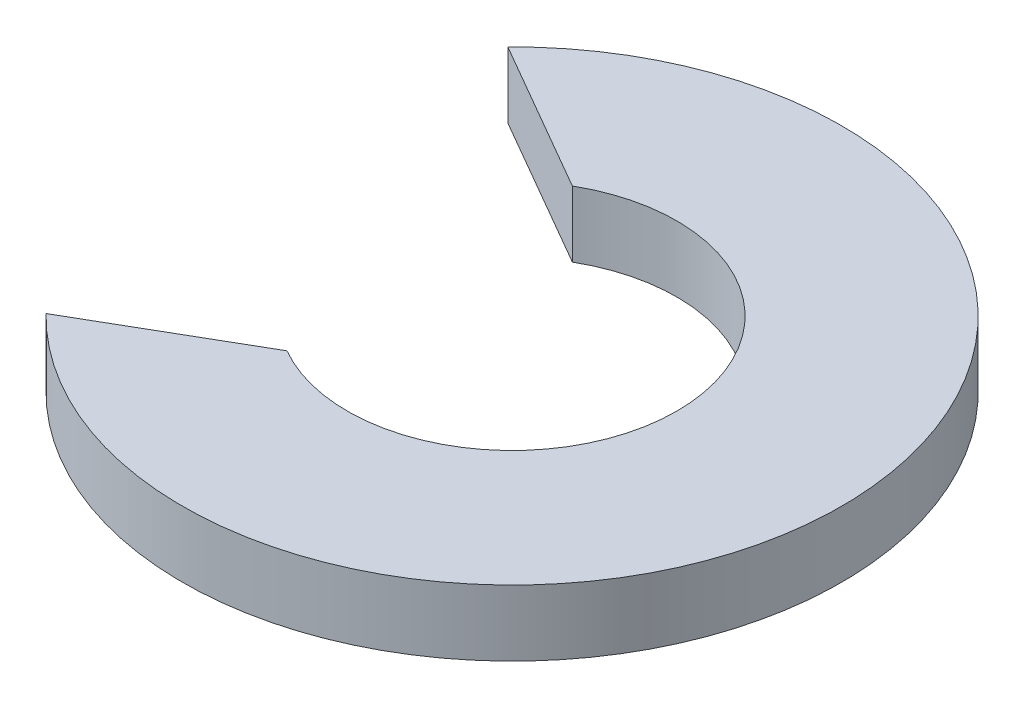
ISO-10303-21;
HEADER;
FILE_DESCRIPTION(('STEP AP214'),'2;1');
FILE_NAME('part.step','',(''),(''),'','','');
FILE_SCHEMA(('AUTOMOTIVE_DESIGN { 1 0 10303 214 1 1 1 1 }'));
ENDSEC;
DATA;
#1=APPLICATION_CONTEXT('core data for automotive mechanical design processes');
#2=APPLICATION_PROTOCOL_DEFINITION('international standard','automotive_design',2000,#1);
#3=PRODUCT_CONTEXT('',#1,'mechanical');
#4=PRODUCT('Part','Part','',(#3));
#5=PRODUCT_RELATED_PRODUCT_CATEGORY('part','',(#4));
#6=PRODUCT_DEFINITION_FORMATION('','',#4);
#7=PRODUCT_DEFINITION_CONTEXT('part definition',#1,'design');
#8=PRODUCT_DEFINITION('design','',#6,#7);
#9=PRODUCT_DEFINITION_SHAPE('','',#8);
#10=(LENGTH_UNIT() NAMED_UNIT(*) SI_UNIT(.MILLI.,.METRE.));
#11=(NAMED_UNIT(*) PLANE_ANGLE_UNIT() SI_UNIT($,.RADIAN.));
#12=(NAMED_UNIT(*) SI_UNIT($,.STERADIAN.) SOLID_ANGLE_UNIT());
#13=UNCERTAINTY_MEASURE_WITH_UNIT(LENGTH_MEASURE(1.E-05),#10,'distance_accuracy_value','');
#14=(GEOMETRIC_REPRESENTATION_CONTEXT(3) GLOBAL_UNCERTAINTY_ASSIGNED_CONTEXT((#13)) GLOBAL_UNIT_ASSIGNED_CONTEXT((#10,
#11,#12)) REPRESENTATION_CONTEXT('',''));
#15=CARTESIAN_POINT('',(0.,0.,0.));
#16=DIRECTION('',(0.,0.,1.));
#17=DIRECTION('',(1.,0.,0.));
#18=AXIS2_PLACEMENT_3D('',#15,#16,#17);
#19=CARTESIAN_POINT('',(0.,0.8,0.));
#20=DIRECTION('',(0.,-1.,0.));
#21=DIRECTION('',(0.,0.,1.));
#22=AXIS2_PLACEMENT_3D('',#19,#20,#21);
#23=CYLINDRICAL_SURFACE('',#22,2.);
#24=CARTESIAN_POINT('',(0.,0.,0.));
#25=DIRECTION('',(0.,1.,0.));
#26=DIRECTION('',(0.,0.,-1.));
#27=AXIS2_PLACEMENT_3D('',#24,#25,#26);
#28=CIRCLE('',#27,2.);
#29=CARTESIAN_POINT('',(-1.,0.,1.73205080756888));
#30=VERTEX_POINT('',#29);
#31=CARTESIAN_POINT('',(-1.,0.,-1.73205080756888));
#32=VERTEX_POINT('',#31);
#33=EDGE_CURVE('E117',#30,#32,#28,.T.);
#34=ORIENTED_EDGE('',*,*,#33,.F.);
#35=DIRECTION('',(0.,-1.,0.));
#36=VECTOR('',#35,1.);
#37=CARTESIAN_POINT('',(-1.,0.8,1.73205080756888));
#38=LINE('',#37,#36);
#39=CARTESIAN_POINT('',(-1.,0.8,1.73205080756888));
#40=VERTEX_POINT('',#39);
#41=EDGE_CURVE('E116',#40,#30,#38,.T.);
#42=ORIENTED_EDGE('',*,*,#41,.F.);
#43=CARTESIAN_POINT('',(0.,0.8,0.));
#44=DIRECTION('',(0.,1.,0.));
#45=DIRECTION('',(0.,0.,-1.));
#46=AXIS2_PLACEMENT_3D('',#43,#44,#45);
#47=CIRCLE('',#46,2.);
#48=CARTESIAN_POINT('',(-1.,0.8,-1.73205080756888));
#49=VERTEX_POINT('',#48);
#50=EDGE_CURVE('E108',#40,#49,#47,.T.);
#51=ORIENTED_EDGE('',*,*,#50,.T.);
#52=DIRECTION('',(0.,-1.,0.));
#53=VECTOR('',#52,1.);
#54=CARTESIAN_POINT('',(-1.,0.8,-1.73205080756888));
#55=LINE('',#54,#53);
#56=EDGE_CURVE('E11',#49,#32,#55,.T.);
#57=ORIENTED_EDGE('',*,*,#56,.T.);
#58=EDGE_LOOP('',(#34,#42,#51,#57));
#59=FACE_BOUND('',#58,.T.);
#60=ADVANCED_FACE('F47',(#59),#23,.F.);
#61=CARTESIAN_POINT('',(-1.,0.8,-1.73205080756888));
#62=DIRECTION('',(0.499999999999995,0.,-0.866025403784442));
#63=DIRECTION('',(0.866025403784442,0.,0.499999999999995));
#64=AXIS2_PLACEMENT_3D('',#61,#62,#63);
#65=PLANE('',#64);
#66=DIRECTION('',(-0.866025403784442,0.,-0.499999999999995));
#67=VECTOR('',#66,1.);
#68=CARTESIAN_POINT('',(-1.,0.,-1.73205080756888));
#69=LINE('',#68,#67);
#70=CARTESIAN_POINT('',(-2.85410196624969,0.,-2.80251707688814));
#71=VERTEX_POINT('',#70);
#72=EDGE_CURVE('E120',#32,#71,#69,.T.);
#73=ORIENTED_EDGE('',*,*,#72,.F.);
#74=ORIENTED_EDGE('',*,*,#56,.F.);
#75=DIRECTION('',(-0.866025403784442,0.,-0.499999999999995));
#76=VECTOR('',#75,1.);
#77=CARTESIAN_POINT('',(-1.,0.8,-1.73205080756888));
#78=LINE('',#77,#76);
#79=CARTESIAN_POINT('',(-2.85410196624969,0.8,-2.80251707688814));
#80=VERTEX_POINT('',#79);
#81=EDGE_CURVE('E89',#49,#80,#78,.T.);
#82=ORIENTED_EDGE('',*,*,#81,.T.);
#83=DIRECTION('',(0.,-1.,0.));
#84=VECTOR('',#83,1.);
#85=CARTESIAN_POINT('',(-2.85410196624969,0.8,-2.80251707688814));
#86=LINE('',#85,#84);
#87=EDGE_CURVE('E56',#80,#71,#86,.T.);
#88=ORIENTED_EDGE('',*,*,#87,.T.);
#89=EDGE_LOOP('',(#73,#74,#82,#88));
#90=FACE_BOUND('',#89,.T.);
#91=ADVANCED_FACE('F105',(#90),#65,.F.);
#92=CARTESIAN_POINT('',(0.,0.8,0.));
#93=DIRECTION('',(0.,-1.,0.));
#94=DIRECTION('',(0.,0.,1.));
#95=AXIS2_PLACEMENT_3D('',#92,#93,#94);
#96=CYLINDRICAL_SURFACE('',#95,4.);
#97=CARTESIAN_POINT('',(0.,0.,0.));
#98=DIRECTION('',(0.,-1.,0.));
#99=DIRECTION('',(0.,0.,-1.));
#100=AXIS2_PLACEMENT_3D('',#97,#98,#99);
#101=CIRCLE('',#100,4.);
#102=CARTESIAN_POINT('',(-2.85410196624969,0.,2.80251707688814));
#103=VERTEX_POINT('',#102);
#104=EDGE_CURVE('E100',#71,#103,#101,.T.);
#105=ORIENTED_EDGE('',*,*,#104,.F.);
#106=ORIENTED_EDGE('',*,*,#87,.F.);
#107=CARTESIAN_POINT('',(0.,0.8,0.));
#108=DIRECTION('',(0.,-1.,0.));
#109=DIRECTION('',(0.,0.,-1.));
#110=AXIS2_PLACEMENT_3D('',#107,#108,#109);
#111=CIRCLE('',#110,4.);
#112=CARTESIAN_POINT('',(-2.85410196624969,0.8,2.80251707688814));
#113=VERTEX_POINT('',#112);
#114=EDGE_CURVE('E92',#80,#113,#111,.T.);
#115=ORIENTED_EDGE('',*,*,#114,.T.);
#116=DIRECTION('',(0.,-1.,0.));
#117=VECTOR('',#116,1.);
#118=CARTESIAN_POINT('',(-2.85410196624969,0.8,2.80251707688814));
#119=LINE('',#118,#117);
#120=EDGE_CURVE('E104',#113,#103,#119,.T.);
#121=ORIENTED_EDGE('',*,*,#120,.T.);
#122=EDGE_LOOP('',(#105,#106,#115,#121));
#123=FACE_BOUND('',#122,.T.);
#124=ADVANCED_FACE('F99',(#123),#96,.T.);
#125=CARTESIAN_POINT('',(-1.,0.8,1.73205080756888));
#126=DIRECTION('',(0.499999999999995,0.,0.866025403784442));
#127=DIRECTION('',(-0.866025403784442,0.,0.499999999999995));
#128=AXIS2_PLACEMENT_3D('',#125,#126,#127);
#129=PLANE('',#128);
#130=DIRECTION('',(0.866025403784442,0.,-0.499999999999995));
#131=VECTOR('',#130,1.);
#132=CARTESIAN_POINT('',(-1.,0.,1.73205080756888));
#133=LINE('',#132,#131);
#134=EDGE_CURVE('E78',#103,#30,#133,.T.);
#135=ORIENTED_EDGE('',*,*,#134,.F.);
#136=ORIENTED_EDGE('',*,*,#120,.F.);
#137=DIRECTION('',(0.866025403784442,0.,-0.499999999999995));
#138=VECTOR('',#137,1.);
#139=CARTESIAN_POINT('',(-1.,0.8,1.73205080756888));
#140=LINE('',#139,#138);
#141=EDGE_CURVE('E64',#113,#40,#140,.T.);
#142=ORIENTED_EDGE('',*,*,#141,.T.);
#143=ORIENTED_EDGE('',*,*,#41,.T.);
#144=EDGE_LOOP('',(#135,#136,#142,#143));
#145=FACE_BOUND('',#144,.T.);
#146=ADVANCED_FACE('F133',(#145),#129,.F.);
#147=CARTESIAN_POINT('',(0.,0.8,0.));
#148=DIRECTION('',(0.,1.,0.));
#149=DIRECTION('',(0.,0.,-1.));
#150=AXIS2_PLACEMENT_3D('',#147,#148,#149);
#151=PLANE('',#150);
#152=ORIENTED_EDGE('',*,*,#50,.F.);
#153=ORIENTED_EDGE('',*,*,#141,.F.);
#154=ORIENTED_EDGE('',*,*,#114,.F.);
#155=ORIENTED_EDGE('',*,*,#81,.F.);
#156=EDGE_LOOP('',(#152,#153,#154,#155));
#157=FACE_BOUND('',#156,.T.);
#158=ADVANCED_FACE('F94',(#157),#151,.T.);
#159=CARTESIAN_POINT('',(0.,0.,0.));
#160=DIRECTION('',(0.,1.,0.));
#161=DIRECTION('',(0.,0.,-1.));
#162=AXIS2_PLACEMENT_3D('',#159,#160,#161);
#163=PLANE('',#162);
#164=ORIENTED_EDGE('',*,*,#33,.T.);
#165=ORIENTED_EDGE('',*,*,#72,.T.);
#166=ORIENTED_EDGE('',*,*,#104,.T.);
#167=ORIENTED_EDGE('',*,*,#134,.T.);
#168=EDGE_LOOP('',(#164,#165,#166,#167));
#169=FACE_BOUND('',#168,.T.);
#170=ADVANCED_FACE('F129',(#169),#163,.F.);
#171=CLOSED_SHELL('',(#60,#91,#124,#146,#158,#170));
#172=MANIFOLD_SOLID_BREP('B2',#171);
#173=ADVANCED_BREP_SHAPE_REPRESENTATION('',(#18,#172),#14);
#174=SHAPE_DEFINITION_REPRESENTATION(#9,#173);
ENDSEC;
END-ISO-10303-21;
